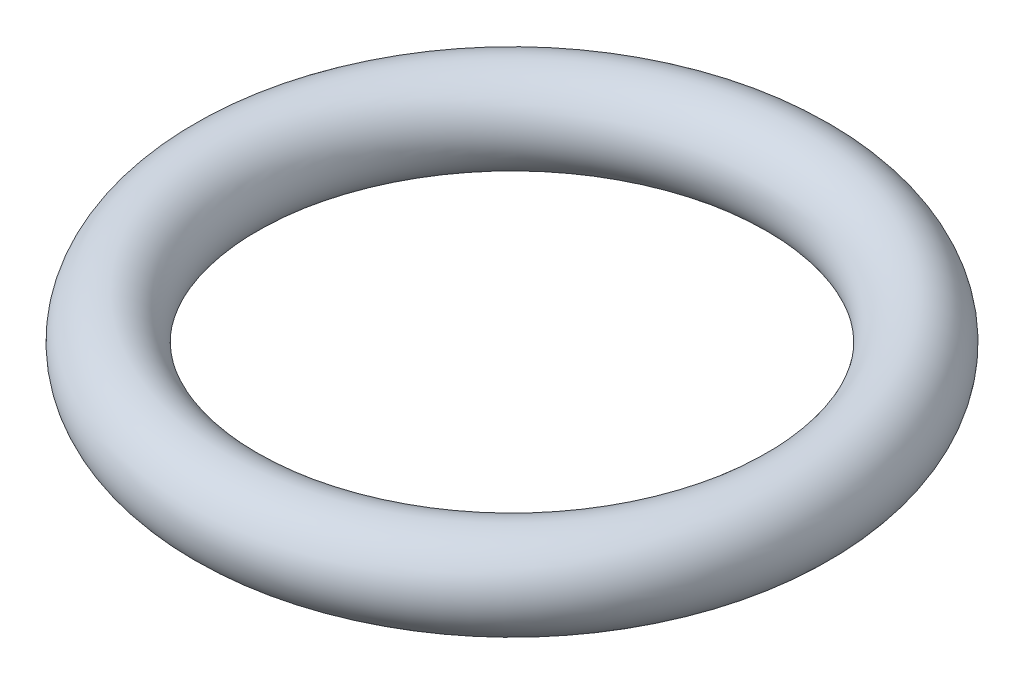
ISO-10303-21;
HEADER;
FILE_DESCRIPTION(('STEP AP214'),'2;1');
FILE_NAME('part.step','',(''),(''),'','','');
FILE_SCHEMA(('AUTOMOTIVE_DESIGN { 1 0 10303 214 1 1 1 1 }'));
ENDSEC;
DATA;
#1=APPLICATION_CONTEXT('core data for automotive mechanical design processes');
#2=APPLICATION_PROTOCOL_DEFINITION('international standard','automotive_design',2000,#1);
#3=PRODUCT_CONTEXT('',#1,'mechanical');
#4=PRODUCT('Part','Part','',(#3));
#5=PRODUCT_RELATED_PRODUCT_CATEGORY('part','',(#4));
#6=PRODUCT_DEFINITION_FORMATION('','',#4);
#7=PRODUCT_DEFINITION_CONTEXT('part definition',#1,'design');
#8=PRODUCT_DEFINITION('design','',#6,#7);
#9=PRODUCT_DEFINITION_SHAPE('','',#8);
#10=(LENGTH_UNIT() NAMED_UNIT(*) SI_UNIT(.MILLI.,.METRE.));
#11=(NAMED_UNIT(*) PLANE_ANGLE_UNIT() SI_UNIT($,.RADIAN.));
#12=(NAMED_UNIT(*) SI_UNIT($,.STERADIAN.) SOLID_ANGLE_UNIT());
#13=UNCERTAINTY_MEASURE_WITH_UNIT(LENGTH_MEASURE(1.E-05),#10,'distance_accuracy_value','');
#14=(GEOMETRIC_REPRESENTATION_CONTEXT(3) GLOBAL_UNCERTAINTY_ASSIGNED_CONTEXT((#13)) GLOBAL_UNIT_ASSIGNED_CONTEXT((#10,
#11,#12)) REPRESENTATION_CONTEXT('',''));
#15=CARTESIAN_POINT('',(0.,0.,0.));
#16=DIRECTION('',(0.,0.,1.));
#17=DIRECTION('',(1.,0.,0.));
#18=AXIS2_PLACEMENT_3D('',#15,#16,#17);
#19=CARTESIAN_POINT('',(0.,0.,0.));
#20=DIRECTION('',(0.,-1.,0.));
#21=DIRECTION('',(0.,0.,-1.));
#22=AXIS2_PLACEMENT_3D('',#19,#20,#21);
#23=TOROIDAL_SURFACE('',#22,13.,2.);
#24=CARTESIAN_POINT('',(0.,0.,-15.));
#25=VERTEX_POINT('',#24);
#26=VERTEX_LOOP('',#25);
#27=FACE_BOUND('',#26,.T.);
#28=ADVANCED_FACE('F29',(#27),#23,.T.);
#29=CLOSED_SHELL('',(#28));
#30=MANIFOLD_SOLID_BREP('B2',#29);
#31=ADVANCED_BREP_SHAPE_REPRESENTATION('',(#18,#30),#14);
#32=SHAPE_DEFINITION_REPRESENTATION(#9,#31);
ENDSEC;
END-ISO-10303-21;
